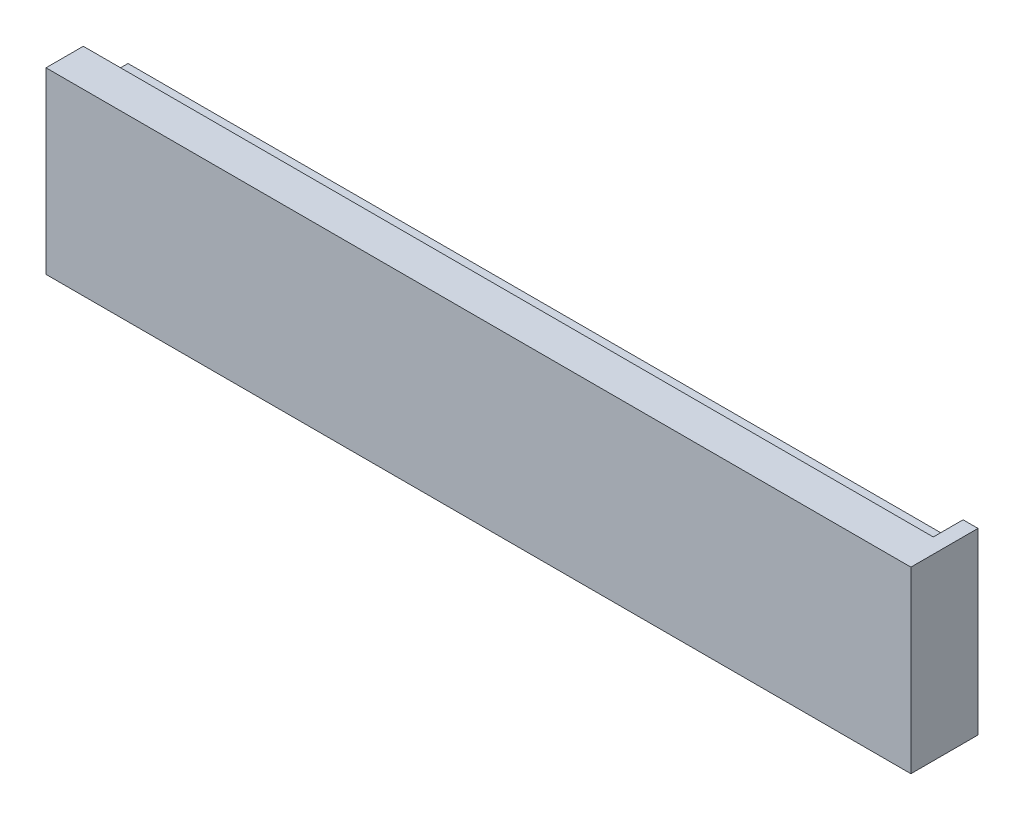
ISO-10303-21;
HEADER;
FILE_DESCRIPTION(('STEP AP214'),'2;1');
FILE_NAME('part.step','',(''),(''),'','','');
FILE_SCHEMA(('AUTOMOTIVE_DESIGN { 1 0 10303 214 1 1 1 1 }'));
ENDSEC;
DATA;
#1=APPLICATION_CONTEXT('core data for automotive mechanical design processes');
#2=APPLICATION_PROTOCOL_DEFINITION('international standard','automotive_design',2000,#1);
#3=PRODUCT_CONTEXT('',#1,'mechanical');
#4=PRODUCT('Part','Part','',(#3));
#5=PRODUCT_RELATED_PRODUCT_CATEGORY('part','',(#4));
#6=PRODUCT_DEFINITION_FORMATION('','',#4);
#7=PRODUCT_DEFINITION_CONTEXT('part definition',#1,'design');
#8=PRODUCT_DEFINITION('design','',#6,#7);
#9=PRODUCT_DEFINITION_SHAPE('','',#8);
#10=(LENGTH_UNIT() NAMED_UNIT(*) SI_UNIT(.MILLI.,.METRE.));
#11=(NAMED_UNIT(*) PLANE_ANGLE_UNIT() SI_UNIT($,.RADIAN.));
#12=(NAMED_UNIT(*) SI_UNIT($,.STERADIAN.) SOLID_ANGLE_UNIT());
#13=UNCERTAINTY_MEASURE_WITH_UNIT(LENGTH_MEASURE(1.E-05),#10,'distance_accuracy_value','');
#14=(GEOMETRIC_REPRESENTATION_CONTEXT(3) GLOBAL_UNCERTAINTY_ASSIGNED_CONTEXT((#13)) GLOBAL_UNIT_ASSIGNED_CONTEXT((#10,
#11,#12)) REPRESENTATION_CONTEXT('',''));
#15=CARTESIAN_POINT('',(0.,0.,0.));
#16=DIRECTION('',(0.,0.,1.));
#17=DIRECTION('',(1.,0.,0.));
#18=AXIS2_PLACEMENT_3D('',#15,#16,#17);
#19=CARTESIAN_POINT('',(144.78,0.,0.));
#20=DIRECTION('',(0.,1.,0.));
#21=DIRECTION('',(0.,0.,1.));
#22=AXIS2_PLACEMENT_3D('',#19,#20,#21);
#23=PLANE('',#22);
#24=DIRECTION('',(0.,0.,-1.));
#25=VECTOR('',#24,1.);
#26=CARTESIAN_POINT('',(0.,0.,0.));
#27=LINE('',#26,#25);
#28=CARTESIAN_POINT('',(0.,0.,7.62));
#29=VERTEX_POINT('',#28);
#30=CARTESIAN_POINT('',(0.,0.,0.));
#31=VERTEX_POINT('',#30);
#32=EDGE_CURVE('E169',#29,#31,#27,.T.);
#33=ORIENTED_EDGE('',*,*,#32,.T.);
#34=DIRECTION('',(-1.,0.,0.));
#35=VECTOR('',#34,1.);
#36=CARTESIAN_POINT('',(144.78,0.,0.));
#37=LINE('',#36,#35);
#38=CARTESIAN_POINT('',(144.78,0.,0.));
#39=VERTEX_POINT('',#38);
#40=EDGE_CURVE('E48',#39,#31,#37,.T.);
#41=ORIENTED_EDGE('',*,*,#40,.F.);
#42=DIRECTION('',(0.,0.,-1.));
#43=VECTOR('',#42,1.);
#44=CARTESIAN_POINT('',(144.78,0.,0.));
#45=LINE('',#44,#43);
#46=CARTESIAN_POINT('',(144.78,0.,2.54));
#47=VERTEX_POINT('',#46);
#48=EDGE_CURVE('E106',#47,#39,#45,.T.);
#49=ORIENTED_EDGE('',*,*,#48,.F.);
#50=CARTESIAN_POINT('',(144.78,0.,7.62));
#51=VERTEX_POINT('',#50);
#52=EDGE_CURVE('E170',#51,#47,#45,.T.);
#53=ORIENTED_EDGE('',*,*,#52,.F.);
#54=DIRECTION('',(-1.,0.,0.));
#55=VECTOR('',#54,1.);
#56=CARTESIAN_POINT('',(144.78,0.,7.62));
#57=LINE('',#56,#55);
#58=EDGE_CURVE('E70',#51,#29,#57,.T.);
#59=ORIENTED_EDGE('',*,*,#58,.T.);
#60=EDGE_LOOP('',(#33,#41,#49,#53,#59));
#61=FACE_BOUND('',#60,.T.);
#62=ADVANCED_FACE('F45',(#61),#23,.F.);
#63=CARTESIAN_POINT('',(144.78,0.,0.));
#64=DIRECTION('',(0.,0.,1.));
#65=DIRECTION('',(1.,0.,0.));
#66=AXIS2_PLACEMENT_3D('',#63,#64,#65);
#67=PLANE('',#66);
#68=DIRECTION('',(0.,1.,0.));
#69=VECTOR('',#68,1.);
#70=CARTESIAN_POINT('',(0.,0.,0.));
#71=LINE('',#70,#69);
#72=CARTESIAN_POINT('',(0.,17.78,0.));
#73=VERTEX_POINT('',#72);
#74=EDGE_CURVE('E185',#31,#73,#71,.T.);
#75=ORIENTED_EDGE('',*,*,#74,.T.);
#76=DIRECTION('',(-1.,0.,0.));
#77=VECTOR('',#76,1.);
#78=CARTESIAN_POINT('',(144.78,17.78,0.));
#79=LINE('',#78,#77);
#80=CARTESIAN_POINT('',(144.78,17.78,0.));
#81=VERTEX_POINT('',#80);
#82=EDGE_CURVE('E217',#81,#73,#79,.T.);
#83=ORIENTED_EDGE('',*,*,#82,.F.);
#84=DIRECTION('',(0.,1.,0.));
#85=VECTOR('',#84,1.);
#86=CARTESIAN_POINT('',(144.78,0.,0.));
#87=LINE('',#86,#85);
#88=EDGE_CURVE('E174',#39,#81,#87,.T.);
#89=ORIENTED_EDGE('',*,*,#88,.F.);
#90=ORIENTED_EDGE('',*,*,#40,.T.);
#91=EDGE_LOOP('',(#75,#83,#89,#90));
#92=FACE_BOUND('',#91,.T.);
#93=ADVANCED_FACE('F228',(#92),#67,.F.);
#94=CARTESIAN_POINT('',(144.78,17.78,0.));
#95=DIRECTION('',(0.,-1.,0.));
#96=DIRECTION('',(0.,0.,-1.));
#97=AXIS2_PLACEMENT_3D('',#94,#95,#96);
#98=PLANE('',#97);
#99=DIRECTION('',(0.,0.,1.));
#100=VECTOR('',#99,1.);
#101=CARTESIAN_POINT('',(0.,17.78,0.));
#102=LINE('',#101,#100);
#103=CARTESIAN_POINT('',(0.,17.78,7.62));
#104=VERTEX_POINT('',#103);
#105=EDGE_CURVE('E188',#73,#104,#102,.T.);
#106=ORIENTED_EDGE('',*,*,#105,.T.);
#107=DIRECTION('',(-1.,0.,0.));
#108=VECTOR('',#107,1.);
#109=CARTESIAN_POINT('',(144.78,17.78,7.62));
#110=LINE('',#109,#108);
#111=CARTESIAN_POINT('',(144.78,17.78,7.62));
#112=VERTEX_POINT('',#111);
#113=EDGE_CURVE('E131',#112,#104,#110,.T.);
#114=ORIENTED_EDGE('',*,*,#113,.F.);
#115=DIRECTION('',(0.,0.,1.));
#116=VECTOR('',#115,1.);
#117=CARTESIAN_POINT('',(144.78,17.78,0.));
#118=LINE('',#117,#116);
#119=CARTESIAN_POINT('',(144.78,17.78,2.54));
#120=VERTEX_POINT('',#119);
#121=EDGE_CURVE('E141',#120,#112,#118,.T.);
#122=ORIENTED_EDGE('',*,*,#121,.F.);
#123=EDGE_CURVE('E144',#81,#120,#118,.T.);
#124=ORIENTED_EDGE('',*,*,#123,.F.);
#125=ORIENTED_EDGE('',*,*,#82,.T.);
#126=EDGE_LOOP('',(#106,#114,#122,#124,#125));
#127=FACE_BOUND('',#126,.T.);
#128=ADVANCED_FACE('F234',(#127),#98,.F.);
#129=CARTESIAN_POINT('',(144.78,17.78,7.62));
#130=DIRECTION('',(0.,0.,1.));
#131=DIRECTION('',(1.,0.,0.));
#132=AXIS2_PLACEMENT_3D('',#129,#130,#131);
#133=PLANE('',#132);
#134=DIRECTION('',(0.,1.,0.));
#135=VECTOR('',#134,1.);
#136=CARTESIAN_POINT('',(0.,17.78,7.62));
#137=LINE('',#136,#135);
#138=CARTESIAN_POINT('',(0.,24.13,7.62));
#139=VERTEX_POINT('',#138);
#140=EDGE_CURVE('E125',#104,#139,#137,.T.);
#141=ORIENTED_EDGE('',*,*,#140,.T.);
#142=DIRECTION('',(-1.,0.,0.));
#143=VECTOR('',#142,1.);
#144=CARTESIAN_POINT('',(144.78,24.13,7.62));
#145=LINE('',#144,#143);
#146=CARTESIAN_POINT('',(144.78,24.13,7.62));
#147=VERTEX_POINT('',#146);
#148=EDGE_CURVE('E118',#147,#139,#145,.T.);
#149=ORIENTED_EDGE('',*,*,#148,.F.);
#150=DIRECTION('',(0.,1.,0.));
#151=VECTOR('',#150,1.);
#152=CARTESIAN_POINT('',(144.78,17.78,7.62));
#153=LINE('',#152,#151);
#154=EDGE_CURVE('E122',#112,#147,#153,.T.);
#155=ORIENTED_EDGE('',*,*,#154,.F.);
#156=ORIENTED_EDGE('',*,*,#113,.T.);
#157=EDGE_LOOP('',(#141,#149,#155,#156));
#158=FACE_BOUND('',#157,.T.);
#159=ADVANCED_FACE('F120',(#158),#133,.F.);
#160=CARTESIAN_POINT('',(144.78,24.13,13.97));
#161=DIRECTION('',(0.,-1.,0.));
#162=DIRECTION('',(0.,0.,-1.));
#163=AXIS2_PLACEMENT_3D('',#160,#161,#162);
#164=PLANE('',#163);
#165=DIRECTION('',(0.,0.,1.));
#166=VECTOR('',#165,1.);
#167=CARTESIAN_POINT('',(0.,24.13,13.97));
#168=LINE('',#167,#166);
#169=CARTESIAN_POINT('',(0.,24.13,13.97));
#170=VERTEX_POINT('',#169);
#171=EDGE_CURVE('E193',#139,#170,#168,.T.);
#172=ORIENTED_EDGE('',*,*,#171,.T.);
#173=DIRECTION('',(-1.,0.,0.));
#174=VECTOR('',#173,1.);
#175=CARTESIAN_POINT('',(144.78,24.13,13.97));
#176=LINE('',#175,#174);
#177=CARTESIAN_POINT('',(147.32,24.13,13.97));
#178=VERTEX_POINT('',#177);
#179=EDGE_CURVE('E132',#178,#170,#176,.T.);
#180=ORIENTED_EDGE('',*,*,#179,.F.);
#181=DIRECTION('',(0.,0.,1.));
#182=VECTOR('',#181,1.);
#183=CARTESIAN_POINT('',(147.32,24.13,13.97));
#184=LINE('',#183,#182);
#185=CARTESIAN_POINT('',(147.32,24.13,2.54));
#186=VERTEX_POINT('',#185);
#187=EDGE_CURVE('E265',#186,#178,#184,.T.);
#188=ORIENTED_EDGE('',*,*,#187,.F.);
#189=DIRECTION('',(-1.,0.,0.));
#190=VECTOR('',#189,1.);
#191=CARTESIAN_POINT('',(147.32,24.13,2.54));
#192=LINE('',#191,#190);
#193=CARTESIAN_POINT('',(144.78,24.13,2.54));
#194=VERTEX_POINT('',#193);
#195=EDGE_CURVE('E150',#186,#194,#192,.T.);
#196=ORIENTED_EDGE('',*,*,#195,.T.);
#197=DIRECTION('',(0.,0.,1.));
#198=VECTOR('',#197,1.);
#199=CARTESIAN_POINT('',(144.78,24.13,13.97));
#200=LINE('',#199,#198);
#201=EDGE_CURVE('E139',#194,#147,#200,.T.);
#202=ORIENTED_EDGE('',*,*,#201,.T.);
#203=ORIENTED_EDGE('',*,*,#148,.T.);
#204=EDGE_LOOP('',(#172,#180,#188,#196,#202,#203));
#205=FACE_BOUND('',#204,.T.);
#206=ADVANCED_FACE('F147',(#205),#164,.F.);
#207=CARTESIAN_POINT('',(144.78,0.,13.97));
#208=DIRECTION('',(0.,0.,-1.));
#209=DIRECTION('',(-1.,0.,0.));
#210=AXIS2_PLACEMENT_3D('',#207,#208,#209);
#211=PLANE('',#210);
#212=DIRECTION('',(0.,-1.,0.));
#213=VECTOR('',#212,1.);
#214=CARTESIAN_POINT('',(0.,0.,13.97));
#215=LINE('',#214,#213);
#216=CARTESIAN_POINT('',(0.,-6.35,13.97));
#217=VERTEX_POINT('',#216);
#218=EDGE_CURVE('E196',#170,#217,#215,.T.);
#219=ORIENTED_EDGE('',*,*,#218,.T.);
#220=DIRECTION('',(-1.,0.,0.));
#221=VECTOR('',#220,1.);
#222=CARTESIAN_POINT('',(144.78,-6.35,13.97));
#223=LINE('',#222,#221);
#224=CARTESIAN_POINT('',(147.32,-6.35,13.97));
#225=VERTEX_POINT('',#224);
#226=EDGE_CURVE('E209',#225,#217,#223,.T.);
#227=ORIENTED_EDGE('',*,*,#226,.F.);
#228=DIRECTION('',(0.,-1.,0.));
#229=VECTOR('',#228,1.);
#230=CARTESIAN_POINT('',(147.32,-6.35,13.97));
#231=LINE('',#230,#229);
#232=EDGE_CURVE('E165',#178,#225,#231,.T.);
#233=ORIENTED_EDGE('',*,*,#232,.F.);
#234=ORIENTED_EDGE('',*,*,#179,.T.);
#235=EDGE_LOOP('',(#219,#227,#233,#234));
#236=FACE_BOUND('',#235,.T.);
#237=ADVANCED_FACE('F274',(#236),#211,.F.);
#238=CARTESIAN_POINT('',(144.78,-6.35,13.97));
#239=DIRECTION('',(0.,1.,0.));
#240=DIRECTION('',(0.,0.,1.));
#241=AXIS2_PLACEMENT_3D('',#238,#239,#240);
#242=PLANE('',#241);
#243=DIRECTION('',(0.,0.,-1.));
#244=VECTOR('',#243,1.);
#245=CARTESIAN_POINT('',(0.,-6.35,13.97));
#246=LINE('',#245,#244);
#247=CARTESIAN_POINT('',(0.,-6.35,7.62));
#248=VERTEX_POINT('',#247);
#249=EDGE_CURVE('E199',#217,#248,#246,.T.);
#250=ORIENTED_EDGE('',*,*,#249,.T.);
#251=DIRECTION('',(-1.,0.,0.));
#252=VECTOR('',#251,1.);
#253=CARTESIAN_POINT('',(144.78,-6.35,7.62));
#254=LINE('',#253,#252);
#255=CARTESIAN_POINT('',(144.78,-6.35,7.62));
#256=VERTEX_POINT('',#255);
#257=EDGE_CURVE('E206',#256,#248,#254,.T.);
#258=ORIENTED_EDGE('',*,*,#257,.F.);
#259=DIRECTION('',(0.,0.,-1.));
#260=VECTOR('',#259,1.);
#261=CARTESIAN_POINT('',(144.78,-6.35,13.97));
#262=LINE('',#261,#260);
#263=CARTESIAN_POINT('',(144.78,-6.35,2.54));
#264=VERTEX_POINT('',#263);
#265=EDGE_CURVE('E240',#256,#264,#262,.T.);
#266=ORIENTED_EDGE('',*,*,#265,.T.);
#267=DIRECTION('',(-1.,0.,0.));
#268=VECTOR('',#267,1.);
#269=CARTESIAN_POINT('',(147.32,-6.35,2.54));
#270=LINE('',#269,#268);
#271=CARTESIAN_POINT('',(147.32,-6.35,2.54));
#272=VERTEX_POINT('',#271);
#273=EDGE_CURVE('E164',#272,#264,#270,.T.);
#274=ORIENTED_EDGE('',*,*,#273,.F.);
#275=DIRECTION('',(0.,0.,-1.));
#276=VECTOR('',#275,1.);
#277=CARTESIAN_POINT('',(147.32,-6.35,13.97));
#278=LINE('',#277,#276);
#279=EDGE_CURVE('E152',#225,#272,#278,.T.);
#280=ORIENTED_EDGE('',*,*,#279,.F.);
#281=ORIENTED_EDGE('',*,*,#226,.T.);
#282=EDGE_LOOP('',(#250,#258,#266,#274,#280,#281));
#283=FACE_BOUND('',#282,.T.);
#284=ADVANCED_FACE('F271',(#283),#242,.F.);
#285=CARTESIAN_POINT('',(144.78,0.,7.62));
#286=DIRECTION('',(0.,0.,1.));
#287=DIRECTION('',(0.,-1.,0.));
#288=AXIS2_PLACEMENT_3D('',#285,#286,#287);
#289=PLANE('',#288);
#290=DIRECTION('',(0.,1.,0.));
#291=VECTOR('',#290,1.);
#292=CARTESIAN_POINT('',(0.,0.,7.62));
#293=LINE('',#292,#291);
#294=EDGE_CURVE('E102',#248,#29,#293,.T.);
#295=ORIENTED_EDGE('',*,*,#294,.T.);
#296=ORIENTED_EDGE('',*,*,#58,.F.);
#297=DIRECTION('',(0.,1.,0.));
#298=VECTOR('',#297,1.);
#299=CARTESIAN_POINT('',(144.78,0.,7.62));
#300=LINE('',#299,#298);
#301=EDGE_CURVE('E143',#256,#51,#300,.T.);
#302=ORIENTED_EDGE('',*,*,#301,.F.);
#303=ORIENTED_EDGE('',*,*,#257,.T.);
#304=EDGE_LOOP('',(#295,#296,#302,#303));
#305=FACE_BOUND('',#304,.T.);
#306=ADVANCED_FACE('F273',(#305),#289,.F.);
#307=CARTESIAN_POINT('',(144.78,0.,0.));
#308=DIRECTION('',(1.,0.,0.));
#309=DIRECTION('',(0.,0.,-1.));
#310=AXIS2_PLACEMENT_3D('',#307,#308,#309);
#311=PLANE('',#310);
#312=DIRECTION('',(0.,1.,0.));
#313=VECTOR('',#312,1.);
#314=CARTESIAN_POINT('',(144.78,-6.35,2.54));
#315=LINE('',#314,#313);
#316=EDGE_CURVE('E11',#47,#120,#315,.T.);
#317=ORIENTED_EDGE('',*,*,#316,.F.);
#318=ORIENTED_EDGE('',*,*,#48,.T.);
#319=ORIENTED_EDGE('',*,*,#88,.T.);
#320=ORIENTED_EDGE('',*,*,#123,.T.);
#321=EDGE_LOOP('',(#317,#318,#319,#320));
#322=FACE_BOUND('',#321,.T.);
#323=ADVANCED_FACE('F280',(#322),#311,.T.);
#324=CARTESIAN_POINT('',(0.,0.,0.));
#325=DIRECTION('',(1.,0.,0.));
#326=DIRECTION('',(0.,0.,-1.));
#327=AXIS2_PLACEMENT_3D('',#324,#325,#326);
#328=PLANE('',#327);
#329=ORIENTED_EDGE('',*,*,#32,.F.);
#330=ORIENTED_EDGE('',*,*,#294,.F.);
#331=ORIENTED_EDGE('',*,*,#249,.F.);
#332=ORIENTED_EDGE('',*,*,#218,.F.);
#333=ORIENTED_EDGE('',*,*,#171,.F.);
#334=ORIENTED_EDGE('',*,*,#140,.F.);
#335=ORIENTED_EDGE('',*,*,#105,.F.);
#336=ORIENTED_EDGE('',*,*,#74,.F.);
#337=EDGE_LOOP('',(#329,#330,#331,#332,#333,#334,#335,#336));
#338=FACE_BOUND('',#337,.T.);
#339=ADVANCED_FACE('F232',(#338),#328,.F.);
#340=CARTESIAN_POINT('',(144.78,0.,0.));
#341=DIRECTION('',(1.,0.,0.));
#342=DIRECTION('',(0.,0.,-1.));
#343=AXIS2_PLACEMENT_3D('',#340,#341,#342);
#344=PLANE('',#343);
#345=EDGE_CURVE('E56',#120,#194,#315,.T.);
#346=ORIENTED_EDGE('',*,*,#345,.F.);
#347=ORIENTED_EDGE('',*,*,#121,.T.);
#348=ORIENTED_EDGE('',*,*,#154,.T.);
#349=ORIENTED_EDGE('',*,*,#201,.F.);
#350=EDGE_LOOP('',(#346,#347,#348,#349));
#351=FACE_BOUND('',#350,.T.);
#352=ADVANCED_FACE('F137',(#351),#344,.F.);
#353=ORIENTED_EDGE('',*,*,#301,.T.);
#354=ORIENTED_EDGE('',*,*,#52,.T.);
#355=EDGE_CURVE('E55',#264,#47,#315,.T.);
#356=ORIENTED_EDGE('',*,*,#355,.F.);
#357=ORIENTED_EDGE('',*,*,#265,.F.);
#358=EDGE_LOOP('',(#353,#354,#356,#357));
#359=FACE_BOUND('',#358,.T.);
#360=ADVANCED_FACE('F248',(#359),#344,.F.);
#361=CARTESIAN_POINT('',(147.32,-6.35,2.54));
#362=DIRECTION('',(0.,0.,1.));
#363=DIRECTION('',(0.,-1.,0.));
#364=AXIS2_PLACEMENT_3D('',#361,#362,#363);
#365=PLANE('',#364);
#366=ORIENTED_EDGE('',*,*,#355,.T.);
#367=ORIENTED_EDGE('',*,*,#316,.T.);
#368=ORIENTED_EDGE('',*,*,#345,.T.);
#369=ORIENTED_EDGE('',*,*,#195,.F.);
#370=DIRECTION('',(0.,1.,0.));
#371=VECTOR('',#370,1.);
#372=CARTESIAN_POINT('',(147.32,-6.35,2.54));
#373=LINE('',#372,#371);
#374=EDGE_CURVE('E157',#272,#186,#373,.T.);
#375=ORIENTED_EDGE('',*,*,#374,.F.);
#376=ORIENTED_EDGE('',*,*,#273,.T.);
#377=EDGE_LOOP('',(#366,#367,#368,#369,#375,#376));
#378=FACE_BOUND('',#377,.T.);
#379=ADVANCED_FACE('F241',(#378),#365,.F.);
#380=CARTESIAN_POINT('',(147.32,0.,0.));
#381=DIRECTION('',(1.,0.,0.));
#382=DIRECTION('',(0.,0.,-1.));
#383=AXIS2_PLACEMENT_3D('',#380,#381,#382);
#384=PLANE('',#383);
#385=ORIENTED_EDGE('',*,*,#279,.T.);
#386=ORIENTED_EDGE('',*,*,#374,.T.);
#387=ORIENTED_EDGE('',*,*,#187,.T.);
#388=ORIENTED_EDGE('',*,*,#232,.T.);
#389=EDGE_LOOP('',(#385,#386,#387,#388));
#390=FACE_BOUND('',#389,.T.);
#391=ADVANCED_FACE('F269',(#390),#384,.T.);
#392=CLOSED_SHELL('',(#62,#93,#128,#159,#206,#237,#284,#306,#323,#339,#352,#360,#379,#391));
#393=MANIFOLD_SOLID_BREP('B2',#392);
#394=ADVANCED_BREP_SHAPE_REPRESENTATION('',(#18,#393),#14);
#395=SHAPE_DEFINITION_REPRESENTATION(#9,#394);
ENDSEC;
END-ISO-10303-21;
